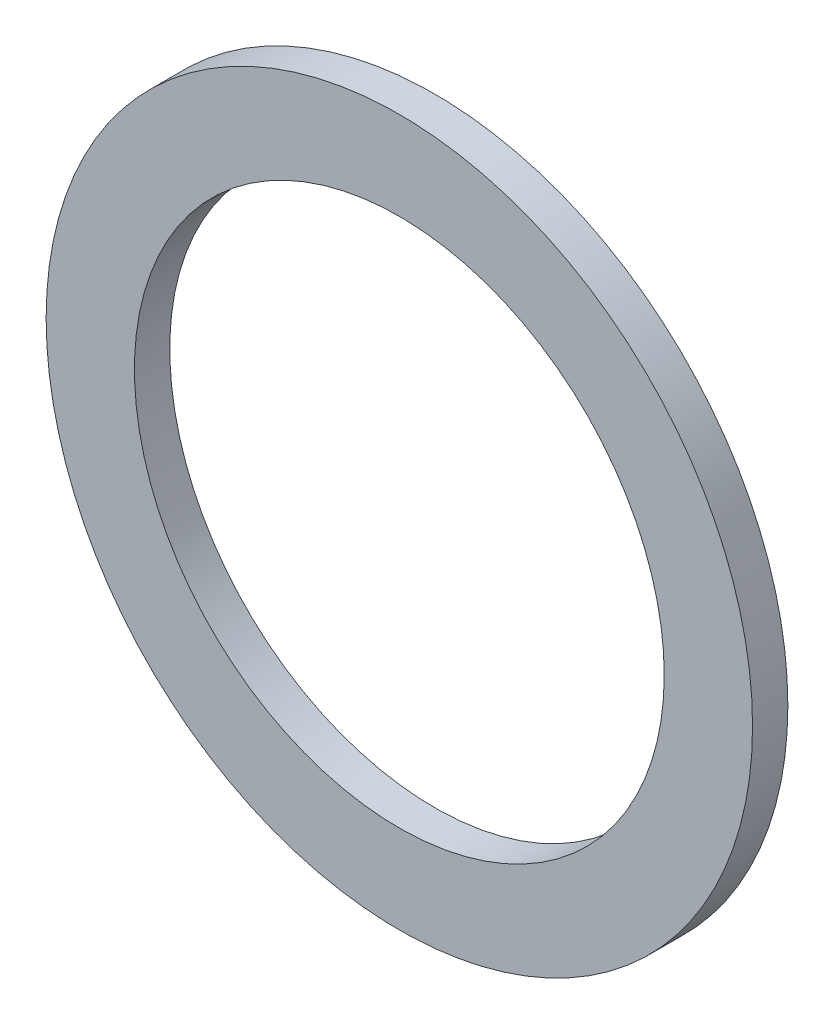
ISO-10303-21;
HEADER;
FILE_DESCRIPTION(('STEP AP214'),'2;1');
FILE_NAME('part.step','',(''),(''),'','','');
FILE_SCHEMA(('AUTOMOTIVE_DESIGN { 1 0 10303 214 1 1 1 1 }'));
ENDSEC;
DATA;
#1=APPLICATION_CONTEXT('core data for automotive mechanical design processes');
#2=APPLICATION_PROTOCOL_DEFINITION('international standard','automotive_design',2000,#1);
#3=PRODUCT_CONTEXT('',#1,'mechanical');
#4=PRODUCT('Part','Part','',(#3));
#5=PRODUCT_RELATED_PRODUCT_CATEGORY('part','',(#4));
#6=PRODUCT_DEFINITION_FORMATION('','',#4);
#7=PRODUCT_DEFINITION_CONTEXT('part definition',#1,'design');
#8=PRODUCT_DEFINITION('design','',#6,#7);
#9=PRODUCT_DEFINITION_SHAPE('','',#8);
#10=(LENGTH_UNIT() NAMED_UNIT(*) SI_UNIT(.MILLI.,.METRE.));
#11=(NAMED_UNIT(*) PLANE_ANGLE_UNIT() SI_UNIT($,.RADIAN.));
#12=(NAMED_UNIT(*) SI_UNIT($,.STERADIAN.) SOLID_ANGLE_UNIT());
#13=UNCERTAINTY_MEASURE_WITH_UNIT(LENGTH_MEASURE(1.E-05),#10,'distance_accuracy_value','');
#14=(GEOMETRIC_REPRESENTATION_CONTEXT(3) GLOBAL_UNCERTAINTY_ASSIGNED_CONTEXT((#13)) GLOBAL_UNIT_ASSIGNED_CONTEXT((#10,
#11,#12)) REPRESENTATION_CONTEXT('',''));
#15=CARTESIAN_POINT('',(0.,0.,0.));
#16=DIRECTION('',(0.,0.,1.));
#17=DIRECTION('',(1.,0.,0.));
#18=AXIS2_PLACEMENT_3D('',#15,#16,#17);
#19=CARTESIAN_POINT('',(0.,0.,0.));
#20=DIRECTION('',(0.,0.,-1.));
#21=DIRECTION('',(1.,0.,0.));
#22=AXIS2_PLACEMENT_3D('',#19,#20,#21);
#23=CYLINDRICAL_SURFACE('',#22,1.99999854);
#24=CARTESIAN_POINT('',(0.,0.,0.1999996));
#25=DIRECTION('',(0.,0.,1.));
#26=DIRECTION('',(1.,0.,0.));
#27=AXIS2_PLACEMENT_3D('',#24,#25,#26);
#28=CIRCLE('',#27,1.99999854);
#29=CARTESIAN_POINT('',(1.99999854,0.,0.1999996));
#30=VERTEX_POINT('',#29);
#31=EDGE_CURVE('E11',#30,#30,#28,.T.);
#32=ORIENTED_EDGE('',*,*,#31,.F.);
#33=DIRECTION('',(0.,0.,1.));
#34=VECTOR('',#33,1.);
#35=CARTESIAN_POINT('',(1.99999854,0.,0.));
#36=LINE('',#35,#34);
#37=CARTESIAN_POINT('',(1.99999854,0.,0.));
#38=VERTEX_POINT('',#37);
#39=EDGE_CURVE('E24',#38,#30,#36,.T.);
#40=ORIENTED_EDGE('',*,*,#39,.F.);
#41=CARTESIAN_POINT('',(0.,0.,0.));
#42=DIRECTION('',(0.,0.,1.));
#43=DIRECTION('',(1.,0.,0.));
#44=AXIS2_PLACEMENT_3D('',#41,#42,#43);
#45=CIRCLE('',#44,1.99999854);
#46=EDGE_CURVE('E46',#38,#38,#45,.T.);
#47=ORIENTED_EDGE('',*,*,#46,.T.);
#48=ORIENTED_EDGE('',*,*,#39,.T.);
#49=EDGE_LOOP('',(#32,#40,#47,#48));
#50=FACE_BOUND('',#49,.T.);
#51=ADVANCED_FACE('F17',(#50),#23,.T.);
#52=CARTESIAN_POINT('',(0.,0.,0.));
#53=DIRECTION('',(0.,0.,-1.));
#54=DIRECTION('',(1.,0.,0.));
#55=AXIS2_PLACEMENT_3D('',#52,#53,#54);
#56=CYLINDRICAL_SURFACE('',#55,1.49999954);
#57=DIRECTION('',(0.,0.,1.));
#58=VECTOR('',#57,1.);
#59=CARTESIAN_POINT('',(1.49999954,0.,0.));
#60=LINE('',#59,#58);
#61=CARTESIAN_POINT('',(1.49999954,0.,0.));
#62=VERTEX_POINT('',#61);
#63=CARTESIAN_POINT('',(1.49999954,0.,0.1999996));
#64=VERTEX_POINT('',#63);
#65=EDGE_CURVE('E40',#62,#64,#60,.T.);
#66=ORIENTED_EDGE('',*,*,#65,.T.);
#67=CARTESIAN_POINT('',(0.,0.,0.1999996));
#68=DIRECTION('',(0.,0.,1.));
#69=DIRECTION('',(1.,0.,0.));
#70=AXIS2_PLACEMENT_3D('',#67,#68,#69);
#71=CIRCLE('',#70,1.49999954);
#72=EDGE_CURVE('E45',#64,#64,#71,.T.);
#73=ORIENTED_EDGE('',*,*,#72,.T.);
#74=ORIENTED_EDGE('',*,*,#65,.F.);
#75=CARTESIAN_POINT('',(0.,0.,0.));
#76=DIRECTION('',(0.,0.,1.));
#77=DIRECTION('',(1.,0.,0.));
#78=AXIS2_PLACEMENT_3D('',#75,#76,#77);
#79=CIRCLE('',#78,1.49999954);
#80=EDGE_CURVE('E43',#62,#62,#79,.T.);
#81=ORIENTED_EDGE('',*,*,#80,.F.);
#82=EDGE_LOOP('',(#66,#73,#74,#81));
#83=FACE_BOUND('',#82,.T.);
#84=ADVANCED_FACE('F42',(#83),#56,.F.);
#85=CARTESIAN_POINT('',(1.99999854,0.,0.));
#86=DIRECTION('',(0.,0.,-1.));
#87=DIRECTION('',(-1.,0.,0.));
#88=AXIS2_PLACEMENT_3D('',#85,#86,#87);
#89=PLANE('',#88);
#90=ORIENTED_EDGE('',*,*,#46,.F.);
#91=EDGE_LOOP('',(#90));
#92=FACE_BOUND('',#91,.T.);
#93=ORIENTED_EDGE('',*,*,#80,.T.);
#94=EDGE_LOOP('',(#93));
#95=FACE_BOUND('',#94,.T.);
#96=ADVANCED_FACE('F49',(#92,#95),#89,.T.);
#97=CARTESIAN_POINT('',(1.99999854,0.,0.1999996));
#98=DIRECTION('',(0.,0.,-1.));
#99=DIRECTION('',(-1.,0.,0.));
#100=AXIS2_PLACEMENT_3D('',#97,#98,#99);
#101=PLANE('',#100);
#102=ORIENTED_EDGE('',*,*,#31,.T.);
#103=EDGE_LOOP('',(#102));
#104=FACE_BOUND('',#103,.T.);
#105=ORIENTED_EDGE('',*,*,#72,.F.);
#106=EDGE_LOOP('',(#105));
#107=FACE_BOUND('',#106,.T.);
#108=ADVANCED_FACE('F56',(#104,#107),#101,.F.);
#109=CLOSED_SHELL('',(#51,#84,#96,#108));
#110=MANIFOLD_SOLID_BREP('B1',#109);
#111=ADVANCED_BREP_SHAPE_REPRESENTATION('',(#18,#110),#14);
#112=SHAPE_DEFINITION_REPRESENTATION(#9,#111);
ENDSEC;
END-ISO-10303-21;
